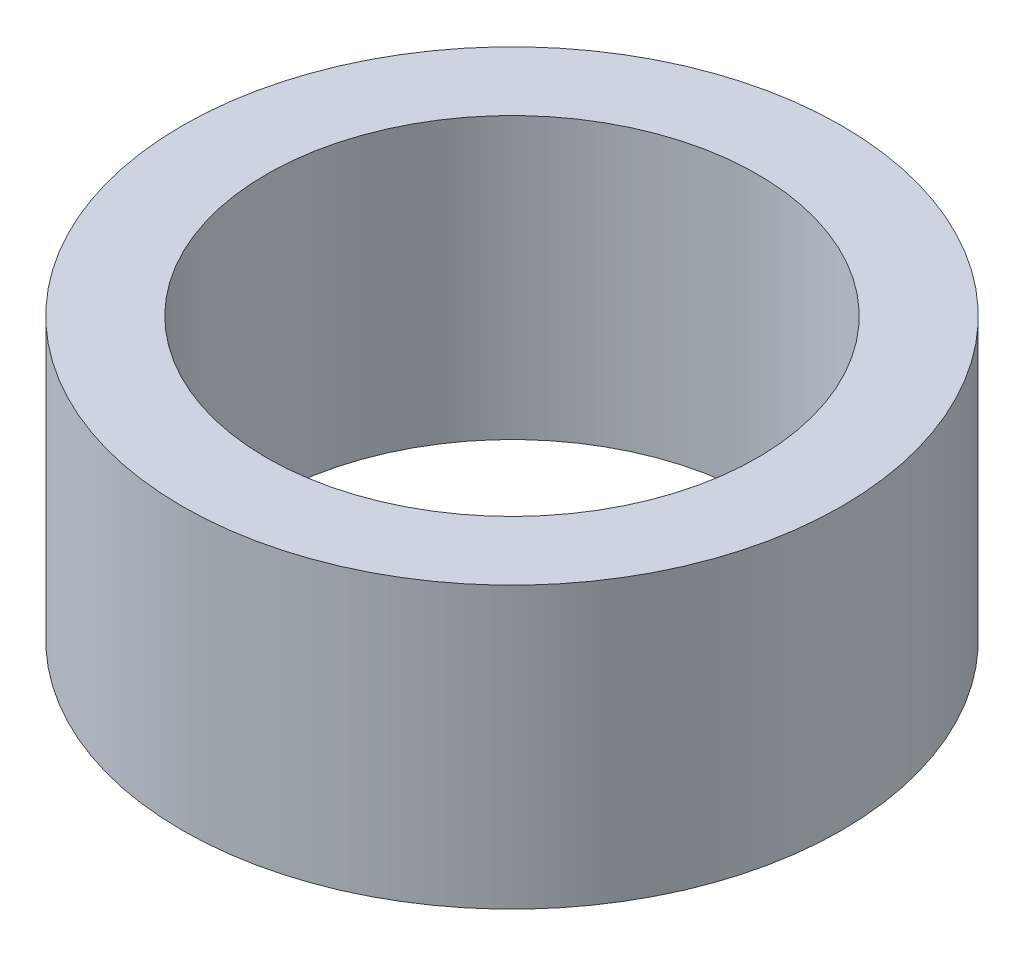
ISO-10303-21;
HEADER;
FILE_DESCRIPTION(('STEP AP214'),'2;1');
FILE_NAME('part.step','',(''),(''),'','','');
FILE_SCHEMA(('AUTOMOTIVE_DESIGN { 1 0 10303 214 1 1 1 1 }'));
ENDSEC;
DATA;
#1=APPLICATION_CONTEXT('core data for automotive mechanical design processes');
#2=APPLICATION_PROTOCOL_DEFINITION('international standard','automotive_design',2000,#1);
#3=PRODUCT_CONTEXT('',#1,'mechanical');
#4=PRODUCT('Part','Part','',(#3));
#5=PRODUCT_RELATED_PRODUCT_CATEGORY('part','',(#4));
#6=PRODUCT_DEFINITION_FORMATION('','',#4);
#7=PRODUCT_DEFINITION_CONTEXT('part definition',#1,'design');
#8=PRODUCT_DEFINITION('design','',#6,#7);
#9=PRODUCT_DEFINITION_SHAPE('','',#8);
#10=(LENGTH_UNIT() NAMED_UNIT(*) SI_UNIT(.MILLI.,.METRE.));
#11=(NAMED_UNIT(*) PLANE_ANGLE_UNIT() SI_UNIT($,.RADIAN.));
#12=(NAMED_UNIT(*) SI_UNIT($,.STERADIAN.) SOLID_ANGLE_UNIT());
#13=UNCERTAINTY_MEASURE_WITH_UNIT(LENGTH_MEASURE(1.E-05),#10,'distance_accuracy_value','');
#14=(GEOMETRIC_REPRESENTATION_CONTEXT(3) GLOBAL_UNCERTAINTY_ASSIGNED_CONTEXT((#13)) GLOBAL_UNIT_ASSIGNED_CONTEXT((#10,
#11,#12)) REPRESENTATION_CONTEXT('',''));
#15=CARTESIAN_POINT('',(0.,0.,0.));
#16=DIRECTION('',(0.,0.,1.));
#17=DIRECTION('',(1.,0.,0.));
#18=AXIS2_PLACEMENT_3D('',#15,#16,#17);
#19=CARTESIAN_POINT('',(0.,20.,0.));
#20=DIRECTION('',(0.,-1.,0.));
#21=DIRECTION('',(0.,0.,-1.));
#22=AXIS2_PLACEMENT_3D('',#19,#20,#21);
#23=CYLINDRICAL_SURFACE('',#22,23.5);
#24=CARTESIAN_POINT('',(0.,20.,0.));
#25=DIRECTION('',(0.,1.,0.));
#26=DIRECTION('',(0.,0.,1.));
#27=AXIS2_PLACEMENT_3D('',#24,#25,#26);
#28=CIRCLE('',#27,23.5);
#29=CARTESIAN_POINT('',(0.,20.,23.5));
#30=VERTEX_POINT('',#29);
#31=EDGE_CURVE('E10',#30,#30,#28,.T.);
#32=ORIENTED_EDGE('',*,*,#31,.F.);
#33=EDGE_LOOP('',(#32));
#34=FACE_BOUND('',#33,.T.);
#35=CARTESIAN_POINT('',(0.,0.,0.));
#36=DIRECTION('',(0.,1.,0.));
#37=DIRECTION('',(0.,0.,1.));
#38=AXIS2_PLACEMENT_3D('',#35,#36,#37);
#39=CIRCLE('',#38,23.5);
#40=CARTESIAN_POINT('',(0.,0.,23.5));
#41=VERTEX_POINT('',#40);
#42=EDGE_CURVE('E37',#41,#41,#39,.T.);
#43=ORIENTED_EDGE('',*,*,#42,.T.);
#44=EDGE_LOOP('',(#43));
#45=FACE_BOUND('',#44,.T.);
#46=ADVANCED_FACE('F40',(#34,#45),#23,.T.);
#47=CARTESIAN_POINT('',(0.,20.,0.));
#48=DIRECTION('',(0.,1.,0.));
#49=DIRECTION('',(0.,0.,1.));
#50=AXIS2_PLACEMENT_3D('',#47,#48,#49);
#51=PLANE('',#50);
#52=CARTESIAN_POINT('',(0.,20.,0.));
#53=DIRECTION('',(0.,1.,0.));
#54=DIRECTION('',(0.,0.,1.));
#55=AXIS2_PLACEMENT_3D('',#52,#53,#54);
#56=CIRCLE('',#55,17.5);
#57=CARTESIAN_POINT('',(0.,20.,17.5));
#58=VERTEX_POINT('',#57);
#59=EDGE_CURVE('E47',#58,#58,#56,.T.);
#60=ORIENTED_EDGE('',*,*,#59,.F.);
#61=EDGE_LOOP('',(#60));
#62=FACE_BOUND('',#61,.T.);
#63=ORIENTED_EDGE('',*,*,#31,.T.);
#64=EDGE_LOOP('',(#63));
#65=FACE_BOUND('',#64,.T.);
#66=ADVANCED_FACE('F62',(#62,#65),#51,.T.);
#67=CARTESIAN_POINT('',(0.,0.,0.));
#68=DIRECTION('',(0.,1.,0.));
#69=DIRECTION('',(0.,0.,1.));
#70=AXIS2_PLACEMENT_3D('',#67,#68,#69);
#71=PLANE('',#70);
#72=CARTESIAN_POINT('',(0.,0.,0.));
#73=DIRECTION('',(0.,1.,0.));
#74=DIRECTION('',(0.,0.,1.));
#75=AXIS2_PLACEMENT_3D('',#72,#73,#74);
#76=CIRCLE('',#75,17.5);
#77=CARTESIAN_POINT('',(0.,0.,17.5));
#78=VERTEX_POINT('',#77);
#79=EDGE_CURVE('E50',#78,#78,#76,.T.);
#80=ORIENTED_EDGE('',*,*,#79,.T.);
#81=EDGE_LOOP('',(#80));
#82=FACE_BOUND('',#81,.T.);
#83=ORIENTED_EDGE('',*,*,#42,.F.);
#84=EDGE_LOOP('',(#83));
#85=FACE_BOUND('',#84,.T.);
#86=ADVANCED_FACE('F54',(#82,#85),#71,.F.);
#87=CARTESIAN_POINT('',(0.,0.,0.));
#88=DIRECTION('',(0.,1.,0.));
#89=DIRECTION('',(0.,0.,1.));
#90=AXIS2_PLACEMENT_3D('',#87,#88,#89);
#91=CYLINDRICAL_SURFACE('',#90,17.5);
#92=ORIENTED_EDGE('',*,*,#79,.F.);
#93=EDGE_LOOP('',(#92));
#94=FACE_BOUND('',#93,.T.);
#95=ORIENTED_EDGE('',*,*,#59,.T.);
#96=EDGE_LOOP('',(#95));
#97=FACE_BOUND('',#96,.T.);
#98=ADVANCED_FACE('F59',(#94,#97),#91,.F.);
#99=CLOSED_SHELL('',(#46,#66,#86,#98));
#100=MANIFOLD_SOLID_BREP('B2',#99);
#101=ADVANCED_BREP_SHAPE_REPRESENTATION('',(#18,#100),#14);
#102=SHAPE_DEFINITION_REPRESENTATION(#9,#101);
ENDSEC;
END-ISO-10303-21;
